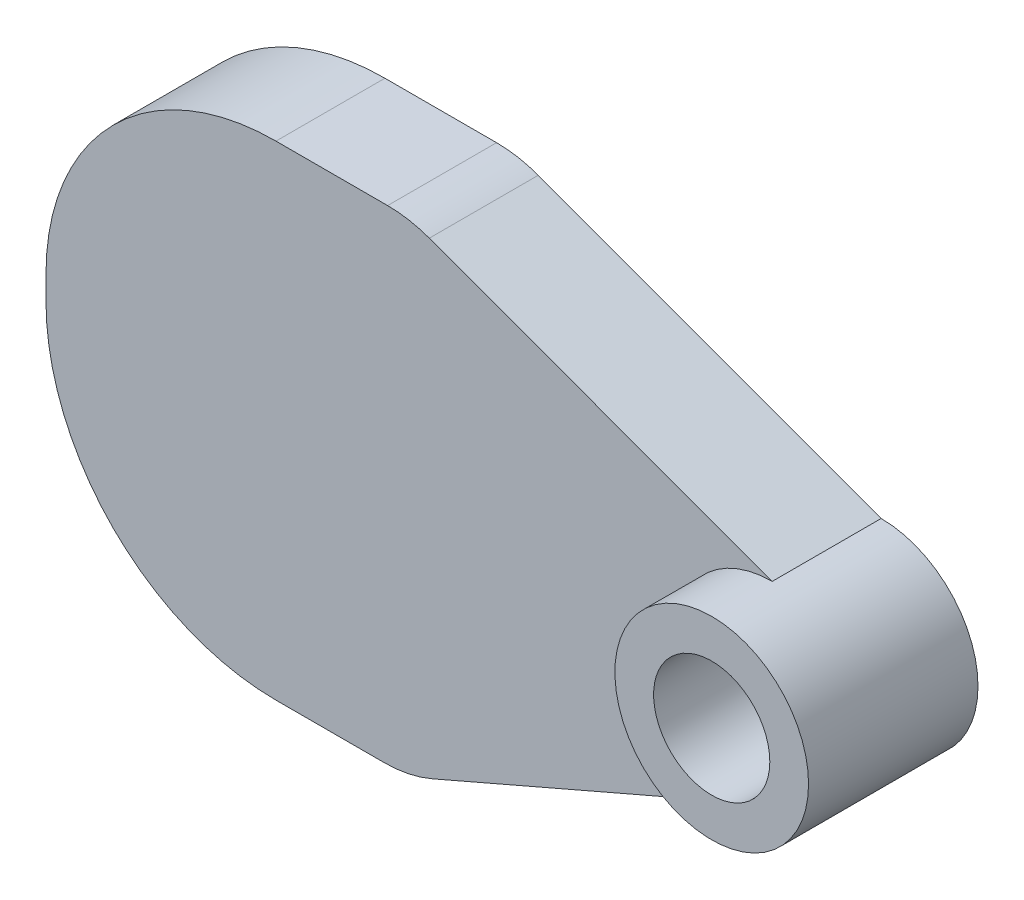
ISO-10303-21;
HEADER;
FILE_DESCRIPTION(('STEP AP214'),'2;1');
FILE_NAME('part.step','',(''),(''),'','','');
FILE_SCHEMA(('AUTOMOTIVE_DESIGN { 1 0 10303 214 1 1 1 1 }'));
ENDSEC;
DATA;
#1=APPLICATION_CONTEXT('core data for automotive mechanical design processes');
#2=APPLICATION_PROTOCOL_DEFINITION('international standard','automotive_design',2000,#1);
#3=PRODUCT_CONTEXT('',#1,'mechanical');
#4=PRODUCT('Part','Part','',(#3));
#5=PRODUCT_RELATED_PRODUCT_CATEGORY('part','',(#4));
#6=PRODUCT_DEFINITION_FORMATION('','',#4);
#7=PRODUCT_DEFINITION_CONTEXT('part definition',#1,'design');
#8=PRODUCT_DEFINITION('design','',#6,#7);
#9=PRODUCT_DEFINITION_SHAPE('','',#8);
#10=(LENGTH_UNIT() NAMED_UNIT(*) SI_UNIT(.MILLI.,.METRE.));
#11=(NAMED_UNIT(*) PLANE_ANGLE_UNIT() SI_UNIT($,.RADIAN.));
#12=(NAMED_UNIT(*) SI_UNIT($,.STERADIAN.) SOLID_ANGLE_UNIT());
#13=UNCERTAINTY_MEASURE_WITH_UNIT(LENGTH_MEASURE(1.E-05),#10,'distance_accuracy_value','');
#14=(GEOMETRIC_REPRESENTATION_CONTEXT(3) GLOBAL_UNCERTAINTY_ASSIGNED_CONTEXT((#13)) GLOBAL_UNIT_ASSIGNED_CONTEXT((#10,
#11,#12)) REPRESENTATION_CONTEXT('',''));
#15=CARTESIAN_POINT('',(0.,0.,0.));
#16=DIRECTION('',(0.,0.,1.));
#17=DIRECTION('',(1.,0.,0.));
#18=AXIS2_PLACEMENT_3D('',#15,#16,#17);
#19=CARTESIAN_POINT('',(25.,0.499999999999997,4.5));
#20=DIRECTION('',(0.,0.,-1.));
#21=DIRECTION('',(-1.,0.,0.));
#22=AXIS2_PLACEMENT_3D('',#19,#20,#21);
#23=CYLINDRICAL_SURFACE('',#22,4.);
#24=CARTESIAN_POINT('',(25.,0.499999999999997,0.));
#25=DIRECTION('',(0.,0.,1.));
#26=DIRECTION('',(1.,0.,0.));
#27=AXIS2_PLACEMENT_3D('',#24,#25,#26);
#28=CIRCLE('',#27,4.);
#29=CARTESIAN_POINT('',(25.,-3.5,0.));
#30=VERTEX_POINT('',#29);
#31=CARTESIAN_POINT('',(25.,4.5,0.));
#32=VERTEX_POINT('',#31);
#33=EDGE_CURVE('E143',#30,#32,#28,.T.);
#34=ORIENTED_EDGE('',*,*,#33,.T.);
#35=DIRECTION('',(0.,0.,-1.));
#36=VECTOR('',#35,1.);
#37=CARTESIAN_POINT('',(25.,4.5,4.5));
#38=LINE('',#37,#36);
#39=CARTESIAN_POINT('',(25.,4.5,4.5));
#40=VERTEX_POINT('',#39);
#41=EDGE_CURVE('E11',#40,#32,#38,.T.);
#42=ORIENTED_EDGE('',*,*,#41,.F.);
#43=CARTESIAN_POINT('',(25.,0.499999999999996,4.5));
#44=DIRECTION('',(0.,0.,1.));
#45=DIRECTION('',(1.,0.,0.));
#46=AXIS2_PLACEMENT_3D('',#43,#44,#45);
#47=CIRCLE('',#46,4.);
#48=CARTESIAN_POINT('',(25.,-3.5,4.5));
#49=VERTEX_POINT('',#48);
#50=EDGE_CURVE('E184',#40,#49,#47,.T.);
#51=ORIENTED_EDGE('',*,*,#50,.T.);
#52=DIRECTION('',(0.,0.,-1.));
#53=VECTOR('',#52,1.);
#54=CARTESIAN_POINT('',(25.,-3.5,4.5));
#55=LINE('',#54,#53);
#56=EDGE_CURVE('E51',#49,#30,#55,.T.);
#57=ORIENTED_EDGE('',*,*,#56,.T.);
#58=EDGE_LOOP('',(#34,#42,#51,#57));
#59=FACE_BOUND('',#58,.T.);
#60=CARTESIAN_POINT('',(25.,0.499999999999996,7.));
#61=DIRECTION('',(0.,0.,1.));
#62=DIRECTION('',(1.,0.,0.));
#63=AXIS2_PLACEMENT_3D('',#60,#61,#62);
#64=CIRCLE('',#63,4.);
#65=CARTESIAN_POINT('',(29.,0.499999999999996,7.));
#66=VERTEX_POINT('',#65);
#67=EDGE_CURVE('E146',#66,#66,#64,.T.);
#68=ORIENTED_EDGE('',*,*,#67,.F.);
#69=EDGE_LOOP('',(#68));
#70=FACE_BOUND('',#69,.T.);
#71=ADVANCED_FACE('F33',(#59,#70),#23,.T.);
#72=CARTESIAN_POINT('',(4.41723800195886,12.0470127326151,4.5));
#73=DIRECTION('',(-0.344254649158423,-0.938876315886609,0.));
#74=DIRECTION('',(0.938876315886609,-0.344254649158423,0.));
#75=AXIS2_PLACEMENT_3D('',#72,#73,#74);
#76=PLANE('',#75);
#77=DIRECTION('',(-0.938876315886609,0.344254649158423,0.));
#78=VECTOR('',#77,1.);
#79=CARTESIAN_POINT('',(4.41723800195886,12.0470127326151,0.));
#80=LINE('',#79,#78);
#81=CARTESIAN_POINT('',(10.8335047833644,9.69438157943303,0.));
#82=VERTEX_POINT('',#81);
#83=EDGE_CURVE('E145',#32,#82,#80,.T.);
#84=ORIENTED_EDGE('',*,*,#83,.T.);
#85=DIRECTION('',(0.,0.,-1.));
#86=VECTOR('',#85,1.);
#87=CARTESIAN_POINT('',(10.8335047833644,9.69438157943303,4.5));
#88=LINE('',#87,#86);
#89=CARTESIAN_POINT('',(10.8335047833644,9.69438157943303,4.5));
#90=VERTEX_POINT('',#89);
#91=EDGE_CURVE('E42',#90,#82,#88,.T.);
#92=ORIENTED_EDGE('',*,*,#91,.F.);
#93=DIRECTION('',(-0.938876315886609,0.344254649158423,0.));
#94=VECTOR('',#93,1.);
#95=CARTESIAN_POINT('',(4.41723800195886,12.0470127326151,4.5));
#96=LINE('',#95,#94);
#97=EDGE_CURVE('E99',#40,#90,#96,.T.);
#98=ORIENTED_EDGE('',*,*,#97,.F.);
#99=ORIENTED_EDGE('',*,*,#41,.T.);
#100=EDGE_LOOP('',(#84,#92,#98,#99));
#101=FACE_BOUND('',#100,.T.);
#102=ADVANCED_FACE('F217',(#101),#76,.F.);
#103=CARTESIAN_POINT('',(9.11223153757231,5.,4.5));
#104=DIRECTION('',(0.,0.,-1.));
#105=DIRECTION('',(-1.,0.,0.));
#106=AXIS2_PLACEMENT_3D('',#103,#104,#105);
#107=CYLINDRICAL_SURFACE('',#106,5.);
#108=CARTESIAN_POINT('',(9.11223153757231,5.,0.));
#109=DIRECTION('',(0.,0.,1.));
#110=DIRECTION('',(1.,0.,0.));
#111=AXIS2_PLACEMENT_3D('',#108,#109,#110);
#112=CIRCLE('',#111,5.);
#113=CARTESIAN_POINT('',(9.11223153757229,10.,0.));
#114=VERTEX_POINT('',#113);
#115=EDGE_CURVE('E149',#114,#82,#112,.F.);
#116=ORIENTED_EDGE('',*,*,#115,.F.);
#117=DIRECTION('',(0.,0.,-1.));
#118=VECTOR('',#117,1.);
#119=CARTESIAN_POINT('',(9.11223153757229,10.,4.5));
#120=LINE('',#119,#118);
#121=CARTESIAN_POINT('',(9.11223153757229,10.,4.5));
#122=VERTEX_POINT('',#121);
#123=EDGE_CURVE('E178',#122,#114,#120,.T.);
#124=ORIENTED_EDGE('',*,*,#123,.F.);
#125=CARTESIAN_POINT('',(9.11223153757231,5.,4.5));
#126=DIRECTION('',(0.,0.,1.));
#127=DIRECTION('',(1.,0.,0.));
#128=AXIS2_PLACEMENT_3D('',#125,#126,#127);
#129=CIRCLE('',#128,5.);
#130=EDGE_CURVE('E189',#122,#90,#129,.F.);
#131=ORIENTED_EDGE('',*,*,#130,.T.);
#132=ORIENTED_EDGE('',*,*,#91,.T.);
#133=EDGE_LOOP('',(#116,#124,#131,#132));
#134=FACE_BOUND('',#133,.T.);
#135=ADVANCED_FACE('F221',(#134),#107,.T.);
#136=CARTESIAN_POINT('',(0.,10.,4.5));
#137=DIRECTION('',(0.,1.,0.));
#138=DIRECTION('',(-1.,0.,0.));
#139=AXIS2_PLACEMENT_3D('',#136,#137,#138);
#140=PLANE('',#139);
#141=DIRECTION('',(1.,0.,0.));
#142=VECTOR('',#141,1.);
#143=CARTESIAN_POINT('',(0.,10.,0.));
#144=LINE('',#143,#142);
#145=CARTESIAN_POINT('',(4.5,10.,0.));
#146=VERTEX_POINT('',#145);
#147=EDGE_CURVE('E152',#146,#114,#144,.T.);
#148=ORIENTED_EDGE('',*,*,#147,.F.);
#149=DIRECTION('',(0.,0.,-1.));
#150=VECTOR('',#149,1.);
#151=CARTESIAN_POINT('',(4.5,10.,4.5));
#152=LINE('',#151,#150);
#153=CARTESIAN_POINT('',(4.5,10.,4.5));
#154=VERTEX_POINT('',#153);
#155=EDGE_CURVE('E176',#154,#146,#152,.T.);
#156=ORIENTED_EDGE('',*,*,#155,.F.);
#157=DIRECTION('',(1.,0.,0.));
#158=VECTOR('',#157,1.);
#159=CARTESIAN_POINT('',(0.,10.,4.5));
#160=LINE('',#159,#158);
#161=EDGE_CURVE('E192',#154,#122,#160,.T.);
#162=ORIENTED_EDGE('',*,*,#161,.T.);
#163=ORIENTED_EDGE('',*,*,#123,.T.);
#164=EDGE_LOOP('',(#148,#156,#162,#163));
#165=FACE_BOUND('',#164,.T.);
#166=ADVANCED_FACE('F333',(#165),#140,.T.);
#167=CARTESIAN_POINT('',(4.5,0.499999999999997,4.5));
#168=DIRECTION('',(0.,0.,-1.));
#169=DIRECTION('',(-1.,0.,0.));
#170=AXIS2_PLACEMENT_3D('',#167,#168,#169);
#171=CYLINDRICAL_SURFACE('',#170,9.5);
#172=CARTESIAN_POINT('',(4.5,0.499999999999997,0.));
#173=DIRECTION('',(0.,0.,1.));
#174=DIRECTION('',(1.,0.,0.));
#175=AXIS2_PLACEMENT_3D('',#172,#173,#174);
#176=CIRCLE('',#175,9.5);
#177=CARTESIAN_POINT('',(-5.,0.499999999999997,0.));
#178=VERTEX_POINT('',#177);
#179=EDGE_CURVE('E155',#178,#146,#176,.F.);
#180=ORIENTED_EDGE('',*,*,#179,.F.);
#181=DIRECTION('',(0.,0.,-1.));
#182=VECTOR('',#181,1.);
#183=CARTESIAN_POINT('',(-5.,0.499999999999997,4.5));
#184=LINE('',#183,#182);
#185=CARTESIAN_POINT('',(-5.,0.499999999999997,4.5));
#186=VERTEX_POINT('',#185);
#187=EDGE_CURVE('E174',#186,#178,#184,.T.);
#188=ORIENTED_EDGE('',*,*,#187,.F.);
#189=CARTESIAN_POINT('',(4.5,0.499999999999997,4.5));
#190=DIRECTION('',(0.,0.,1.));
#191=DIRECTION('',(1.,0.,0.));
#192=AXIS2_PLACEMENT_3D('',#189,#190,#191);
#193=CIRCLE('',#192,9.5);
#194=EDGE_CURVE('E195',#186,#154,#193,.F.);
#195=ORIENTED_EDGE('',*,*,#194,.T.);
#196=ORIENTED_EDGE('',*,*,#155,.T.);
#197=EDGE_LOOP('',(#180,#188,#195,#196));
#198=FACE_BOUND('',#197,.T.);
#199=ADVANCED_FACE('F323',(#198),#171,.T.);
#200=CARTESIAN_POINT('',(-5.,0.,4.5));
#201=DIRECTION('',(-1.,0.,0.));
#202=DIRECTION('',(0.,0.,1.));
#203=AXIS2_PLACEMENT_3D('',#200,#201,#202);
#204=PLANE('',#203);
#205=DIRECTION('',(0.,1.,0.));
#206=VECTOR('',#205,1.);
#207=CARTESIAN_POINT('',(-5.,0.,0.));
#208=LINE('',#207,#206);
#209=CARTESIAN_POINT('',(-5.,-0.500000000000004,0.));
#210=VERTEX_POINT('',#209);
#211=EDGE_CURVE('E158',#210,#178,#208,.T.);
#212=ORIENTED_EDGE('',*,*,#211,.F.);
#213=DIRECTION('',(0.,0.,-1.));
#214=VECTOR('',#213,1.);
#215=CARTESIAN_POINT('',(-5.,-0.500000000000004,4.5));
#216=LINE('',#215,#214);
#217=CARTESIAN_POINT('',(-5.,-0.500000000000004,4.5));
#218=VERTEX_POINT('',#217);
#219=EDGE_CURVE('E172',#218,#210,#216,.T.);
#220=ORIENTED_EDGE('',*,*,#219,.F.);
#221=DIRECTION('',(0.,1.,0.));
#222=VECTOR('',#221,1.);
#223=CARTESIAN_POINT('',(-5.,0.,4.5));
#224=LINE('',#223,#222);
#225=EDGE_CURVE('E198',#218,#186,#224,.T.);
#226=ORIENTED_EDGE('',*,*,#225,.T.);
#227=ORIENTED_EDGE('',*,*,#187,.T.);
#228=EDGE_LOOP('',(#212,#220,#226,#227));
#229=FACE_BOUND('',#228,.T.);
#230=ADVANCED_FACE('F314',(#229),#204,.T.);
#231=CARTESIAN_POINT('',(4.5,-0.500000000000004,4.5));
#232=DIRECTION('',(0.,0.,-1.));
#233=DIRECTION('',(-1.,0.,0.));
#234=AXIS2_PLACEMENT_3D('',#231,#232,#233);
#235=CYLINDRICAL_SURFACE('',#234,9.5);
#236=CARTESIAN_POINT('',(4.5,-0.500000000000004,0.));
#237=DIRECTION('',(0.,0.,1.));
#238=DIRECTION('',(1.,0.,0.));
#239=AXIS2_PLACEMENT_3D('',#236,#237,#238);
#240=CIRCLE('',#239,9.5);
#241=CARTESIAN_POINT('',(4.5,-10.,0.));
#242=VERTEX_POINT('',#241);
#243=EDGE_CURVE('E161',#242,#210,#240,.F.);
#244=ORIENTED_EDGE('',*,*,#243,.F.);
#245=DIRECTION('',(0.,0.,-1.));
#246=VECTOR('',#245,1.);
#247=CARTESIAN_POINT('',(4.5,-10.,4.5));
#248=LINE('',#247,#246);
#249=CARTESIAN_POINT('',(4.5,-10.,4.5));
#250=VERTEX_POINT('',#249);
#251=EDGE_CURVE('E136',#250,#242,#248,.T.);
#252=ORIENTED_EDGE('',*,*,#251,.F.);
#253=CARTESIAN_POINT('',(4.5,-0.500000000000004,4.5));
#254=DIRECTION('',(0.,0.,1.));
#255=DIRECTION('',(1.,0.,0.));
#256=AXIS2_PLACEMENT_3D('',#253,#254,#255);
#257=CIRCLE('',#256,9.5);
#258=EDGE_CURVE('E126',#250,#218,#257,.F.);
#259=ORIENTED_EDGE('',*,*,#258,.T.);
#260=ORIENTED_EDGE('',*,*,#219,.T.);
#261=EDGE_LOOP('',(#244,#252,#259,#260));
#262=FACE_BOUND('',#261,.T.);
#263=ADVANCED_FACE('F202',(#262),#235,.T.);
#264=CARTESIAN_POINT('',(0.,-10.,4.5));
#265=DIRECTION('',(0.,1.,0.));
#266=DIRECTION('',(0.,0.,1.));
#267=AXIS2_PLACEMENT_3D('',#264,#265,#266);
#268=PLANE('',#267);
#269=DIRECTION('',(1.,0.,0.));
#270=VECTOR('',#269,1.);
#271=CARTESIAN_POINT('',(0.,-10.,0.));
#272=LINE('',#271,#270);
#273=CARTESIAN_POINT('',(8.96324405825243,-10.,0.));
#274=VERTEX_POINT('',#273);
#275=EDGE_CURVE('E133',#242,#274,#272,.T.);
#276=ORIENTED_EDGE('',*,*,#275,.T.);
#277=DIRECTION('',(0.,0.,-1.));
#278=VECTOR('',#277,1.);
#279=CARTESIAN_POINT('',(8.96324405825243,-10.,4.5));
#280=LINE('',#279,#278);
#281=CARTESIAN_POINT('',(8.96324405825243,-10.,4.5));
#282=VERTEX_POINT('',#281);
#283=EDGE_CURVE('E130',#282,#274,#280,.T.);
#284=ORIENTED_EDGE('',*,*,#283,.F.);
#285=DIRECTION('',(1.,0.,0.));
#286=VECTOR('',#285,1.);
#287=CARTESIAN_POINT('',(0.,-10.,4.5));
#288=LINE('',#287,#286);
#289=EDGE_CURVE('E119',#250,#282,#288,.T.);
#290=ORIENTED_EDGE('',*,*,#289,.F.);
#291=ORIENTED_EDGE('',*,*,#251,.T.);
#292=EDGE_LOOP('',(#276,#284,#290,#291));
#293=FACE_BOUND('',#292,.T.);
#294=ADVANCED_FACE('F131',(#293),#268,.F.);
#295=CARTESIAN_POINT('',(8.96324405825244,-5.,4.5));
#296=DIRECTION('',(0.,0.,-1.));
#297=DIRECTION('',(-1.,0.,0.));
#298=AXIS2_PLACEMENT_3D('',#295,#296,#297);
#299=CYLINDRICAL_SURFACE('',#298,5.);
#300=CARTESIAN_POINT('',(8.96324405825244,-5.,0.));
#301=DIRECTION('',(0.,0.,1.));
#302=DIRECTION('',(1.,0.,0.));
#303=AXIS2_PLACEMENT_3D('',#300,#301,#302);
#304=CIRCLE('',#303,5.);
#305=CARTESIAN_POINT('',(10.951281246424,-9.58777812654962,0.));
#306=VERTEX_POINT('',#305);
#307=EDGE_CURVE('E165',#274,#306,#304,.T.);
#308=ORIENTED_EDGE('',*,*,#307,.T.);
#309=DIRECTION('',(0.,0.,-1.));
#310=VECTOR('',#309,1.);
#311=CARTESIAN_POINT('',(10.951281246424,-9.58777812654962,4.5));
#312=LINE('',#311,#310);
#313=CARTESIAN_POINT('',(10.951281246424,-9.58777812654962,4.5));
#314=VERTEX_POINT('',#313);
#315=EDGE_CURVE('E85',#314,#306,#312,.T.);
#316=ORIENTED_EDGE('',*,*,#315,.F.);
#317=CARTESIAN_POINT('',(8.96324405825244,-5.,4.5));
#318=DIRECTION('',(0.,0.,1.));
#319=DIRECTION('',(1.,0.,0.));
#320=AXIS2_PLACEMENT_3D('',#317,#318,#319);
#321=CIRCLE('',#320,5.);
#322=EDGE_CURVE('E123',#282,#314,#321,.T.);
#323=ORIENTED_EDGE('',*,*,#322,.F.);
#324=ORIENTED_EDGE('',*,*,#283,.T.);
#325=EDGE_LOOP('',(#308,#316,#323,#324));
#326=FACE_BOUND('',#325,.T.);
#327=ADVANCED_FACE('F138',(#326),#299,.T.);
#328=CARTESIAN_POINT('',(5.22918615528532,-12.067352666043,4.5));
#329=DIRECTION('',(0.397607437634301,-0.917555625309924,0.));
#330=DIRECTION('',(0.917555625309924,0.397607437634301,0.));
#331=AXIS2_PLACEMENT_3D('',#328,#329,#330);
#332=PLANE('',#331);
#333=DIRECTION('',(-0.917555625309924,-0.397607437634301,0.));
#334=VECTOR('',#333,1.);
#335=CARTESIAN_POINT('',(5.22918615528532,-12.067352666043,0.));
#336=LINE('',#335,#334);
#337=EDGE_CURVE('E167',#30,#306,#336,.T.);
#338=ORIENTED_EDGE('',*,*,#337,.F.);
#339=ORIENTED_EDGE('',*,*,#56,.F.);
#340=DIRECTION('',(-0.917555625309924,-0.397607437634301,0.));
#341=VECTOR('',#340,1.);
#342=CARTESIAN_POINT('',(5.22918615528532,-12.067352666043,4.5));
#343=LINE('',#342,#341);
#344=EDGE_CURVE('E139',#49,#314,#343,.T.);
#345=ORIENTED_EDGE('',*,*,#344,.T.);
#346=ORIENTED_EDGE('',*,*,#315,.T.);
#347=EDGE_LOOP('',(#338,#339,#345,#346));
#348=FACE_BOUND('',#347,.T.);
#349=ADVANCED_FACE('F206',(#348),#332,.T.);
#350=CARTESIAN_POINT('',(0.,0.,4.5));
#351=DIRECTION('',(0.,0.,1.));
#352=DIRECTION('',(1.,0.,0.));
#353=AXIS2_PLACEMENT_3D('',#350,#351,#352);
#354=PLANE('',#353);
#355=ORIENTED_EDGE('',*,*,#50,.F.);
#356=ORIENTED_EDGE('',*,*,#97,.T.);
#357=ORIENTED_EDGE('',*,*,#130,.F.);
#358=ORIENTED_EDGE('',*,*,#161,.F.);
#359=ORIENTED_EDGE('',*,*,#194,.F.);
#360=ORIENTED_EDGE('',*,*,#225,.F.);
#361=ORIENTED_EDGE('',*,*,#258,.F.);
#362=ORIENTED_EDGE('',*,*,#289,.T.);
#363=ORIENTED_EDGE('',*,*,#322,.T.);
#364=ORIENTED_EDGE('',*,*,#344,.F.);
#365=EDGE_LOOP('',(#355,#356,#357,#358,#359,#360,#361,#362,#363,#364));
#366=FACE_BOUND('',#365,.T.);
#367=ADVANCED_FACE('F121',(#366),#354,.T.);
#368=CARTESIAN_POINT('',(0.,0.,0.));
#369=DIRECTION('',(0.,0.,1.));
#370=DIRECTION('',(1.,0.,0.));
#371=AXIS2_PLACEMENT_3D('',#368,#369,#370);
#372=PLANE('',#371);
#373=ORIENTED_EDGE('',*,*,#33,.F.);
#374=ORIENTED_EDGE('',*,*,#337,.T.);
#375=ORIENTED_EDGE('',*,*,#307,.F.);
#376=ORIENTED_EDGE('',*,*,#275,.F.);
#377=ORIENTED_EDGE('',*,*,#243,.T.);
#378=ORIENTED_EDGE('',*,*,#211,.T.);
#379=ORIENTED_EDGE('',*,*,#179,.T.);
#380=ORIENTED_EDGE('',*,*,#147,.T.);
#381=ORIENTED_EDGE('',*,*,#115,.T.);
#382=ORIENTED_EDGE('',*,*,#83,.F.);
#383=EDGE_LOOP('',(#373,#374,#375,#376,#377,#378,#379,#380,#381,#382));
#384=FACE_BOUND('',#383,.T.);
#385=ADVANCED_FACE('F205',(#384),#372,.F.);
#386=CARTESIAN_POINT('',(25.,0.499999999999996,7.));
#387=DIRECTION('',(0.,0.,1.));
#388=DIRECTION('',(1.,0.,0.));
#389=AXIS2_PLACEMENT_3D('',#386,#387,#388);
#390=PLANE('',#389);
#391=CARTESIAN_POINT('',(25.,0.499999999999996,7.));
#392=DIRECTION('',(0.,0.,1.));
#393=DIRECTION('',(1.,0.,0.));
#394=AXIS2_PLACEMENT_3D('',#391,#392,#393);
#395=CIRCLE('',#394,2.4);
#396=CARTESIAN_POINT('',(27.4,0.499999999999996,7.));
#397=VERTEX_POINT('',#396);
#398=EDGE_CURVE('E248',#397,#397,#395,.T.);
#399=ORIENTED_EDGE('',*,*,#398,.F.);
#400=EDGE_LOOP('',(#399));
#401=FACE_BOUND('',#400,.T.);
#402=ORIENTED_EDGE('',*,*,#67,.T.);
#403=EDGE_LOOP('',(#402));
#404=FACE_BOUND('',#403,.T.);
#405=ADVANCED_FACE('F228',(#401,#404),#390,.T.);
#406=CARTESIAN_POINT('',(25.,0.499999999999996,3.5));
#407=DIRECTION('',(0.,0.,1.));
#408=DIRECTION('',(1.,0.,0.));
#409=AXIS2_PLACEMENT_3D('',#406,#407,#408);
#410=CYLINDRICAL_SURFACE('',#409,2.4);
#411=CARTESIAN_POINT('',(25.,0.499999999999996,3.5));
#412=DIRECTION('',(0.,0.,1.));
#413=DIRECTION('',(1.,0.,0.));
#414=AXIS2_PLACEMENT_3D('',#411,#412,#413);
#415=CIRCLE('',#414,2.4);
#416=CARTESIAN_POINT('',(27.4,0.499999999999996,3.5));
#417=VERTEX_POINT('',#416);
#418=EDGE_CURVE('E187',#417,#417,#415,.T.);
#419=ORIENTED_EDGE('',*,*,#418,.F.);
#420=EDGE_LOOP('',(#419));
#421=FACE_BOUND('',#420,.T.);
#422=ORIENTED_EDGE('',*,*,#398,.T.);
#423=EDGE_LOOP('',(#422));
#424=FACE_BOUND('',#423,.T.);
#425=ADVANCED_FACE('F230',(#421,#424),#410,.F.);
#426=CARTESIAN_POINT('',(25.,0.499999999999996,3.5));
#427=DIRECTION('',(0.,0.,1.));
#428=DIRECTION('',(1.,0.,0.));
#429=AXIS2_PLACEMENT_3D('',#426,#427,#428);
#430=PLANE('',#429);
#431=ORIENTED_EDGE('',*,*,#418,.T.);
#432=EDGE_LOOP('',(#431));
#433=FACE_BOUND('',#432,.T.);
#434=ADVANCED_FACE('F237',(#433),#430,.T.);
#435=CLOSED_SHELL('',(#71,#102,#135,#166,#199,#230,#263,#294,#327,#349,#367,#385,#405,#425,#434));
#436=MANIFOLD_SOLID_BREP('B2',#435);
#437=ADVANCED_BREP_SHAPE_REPRESENTATION('',(#18,#436),#14);
#438=SHAPE_DEFINITION_REPRESENTATION(#9,#437);
ENDSEC;
END-ISO-10303-21;
